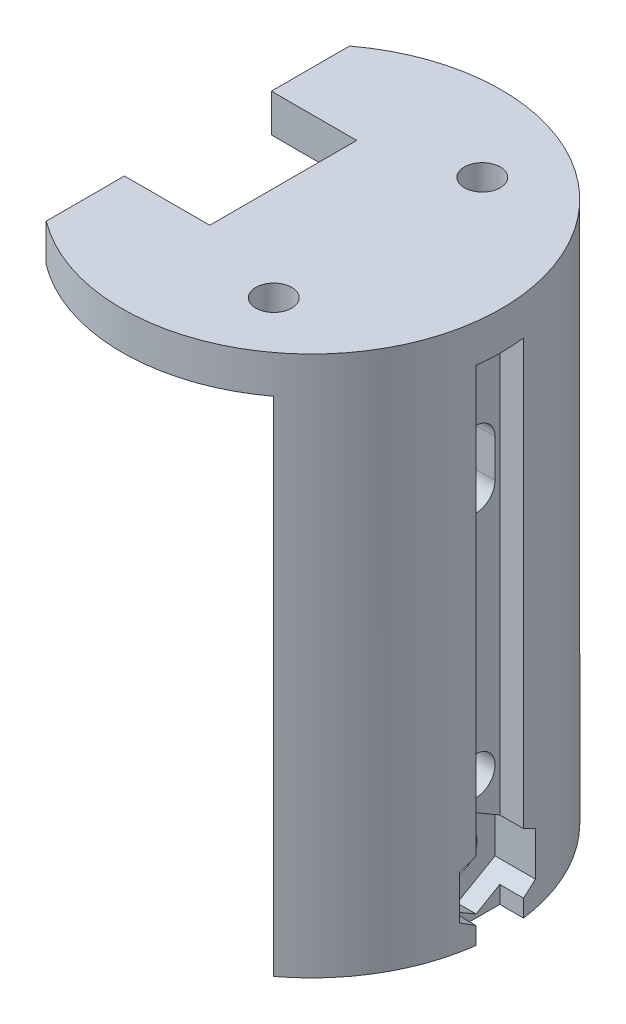
ISO-10303-21;
HEADER;
FILE_DESCRIPTION(('STEP AP214'),'2;1');
FILE_NAME('part.step','',(''),(''),'','','');
FILE_SCHEMA(('AUTOMOTIVE_DESIGN { 1 0 10303 214 1 1 1 1 }'));
ENDSEC;
DATA;
#1=APPLICATION_CONTEXT('core data for automotive mechanical design processes');
#2=APPLICATION_PROTOCOL_DEFINITION('international standard','automotive_design',2000,#1);
#3=PRODUCT_CONTEXT('',#1,'mechanical');
#4=PRODUCT('Part','Part','',(#3));
#5=PRODUCT_RELATED_PRODUCT_CATEGORY('part','',(#4));
#6=PRODUCT_DEFINITION_FORMATION('','',#4);
#7=PRODUCT_DEFINITION_CONTEXT('part definition',#1,'design');
#8=PRODUCT_DEFINITION('design','',#6,#7);
#9=PRODUCT_DEFINITION_SHAPE('','',#8);
#10=(LENGTH_UNIT() NAMED_UNIT(*) SI_UNIT(.MILLI.,.METRE.));
#11=(NAMED_UNIT(*) PLANE_ANGLE_UNIT() SI_UNIT($,.RADIAN.));
#12=(NAMED_UNIT(*) SI_UNIT($,.STERADIAN.) SOLID_ANGLE_UNIT());
#13=UNCERTAINTY_MEASURE_WITH_UNIT(LENGTH_MEASURE(1.E-05),#10,'distance_accuracy_value','');
#14=(GEOMETRIC_REPRESENTATION_CONTEXT(3) GLOBAL_UNCERTAINTY_ASSIGNED_CONTEXT((#13)) GLOBAL_UNIT_ASSIGNED_CONTEXT((#10,
#11,#12)) REPRESENTATION_CONTEXT('',''));
#15=CARTESIAN_POINT('',(0.,0.,0.));
#16=DIRECTION('',(0.,0.,1.));
#17=DIRECTION('',(1.,0.,0.));
#18=AXIS2_PLACEMENT_3D('',#15,#16,#17);
#19=CARTESIAN_POINT('',(22.0257812378826,-67.31,-3.175));
#20=DIRECTION('',(0.,0.,-1.));
#21=DIRECTION('',(-1.,0.,0.));
#22=AXIS2_PLACEMENT_3D('',#19,#20,#21);
#23=PLANE('',#22);
#24=DIRECTION('',(0.,1.,0.));
#25=VECTOR('',#24,1.);
#26=CARTESIAN_POINT('',(22.0257812378826,-67.31,-3.175));
#27=LINE('',#26,#25);
#28=CARTESIAN_POINT('',(22.0257812378826,-56.9272083697105,-3.175));
#29=VERTEX_POINT('',#28);
#30=CARTESIAN_POINT('',(22.0257812378826,0.,-3.175));
#31=VERTEX_POINT('',#30);
#32=EDGE_CURVE('E258',#29,#31,#27,.T.);
#33=ORIENTED_EDGE('',*,*,#32,.F.);
#34=DIRECTION('',(1.,0.,0.));
#35=VECTOR('',#34,1.);
#36=CARTESIAN_POINT('',(25.4009999999925,-56.9272083697105,-3.175));
#37=LINE('',#36,#35);
#38=CARTESIAN_POINT('',(25.2007812378826,-56.9272083697105,-3.175));
#39=VERTEX_POINT('',#38);
#40=EDGE_CURVE('E528',#29,#39,#37,.T.);
#41=ORIENTED_EDGE('',*,*,#40,.T.);
#42=DIRECTION('',(0.,1.,0.));
#43=VECTOR('',#42,1.);
#44=CARTESIAN_POINT('',(25.2007812378826,-67.31,-3.175));
#45=LINE('',#44,#43);
#46=CARTESIAN_POINT('',(25.2007812378826,0.,-3.175));
#47=VERTEX_POINT('',#46);
#48=EDGE_CURVE('E262',#39,#47,#45,.T.);
#49=ORIENTED_EDGE('',*,*,#48,.T.);
#50=DIRECTION('',(-1.,0.,0.));
#51=VECTOR('',#50,1.);
#52=CARTESIAN_POINT('',(22.0257812378826,0.,-3.175));
#53=LINE('',#52,#51);
#54=EDGE_CURVE('E367',#47,#31,#53,.T.);
#55=ORIENTED_EDGE('',*,*,#54,.T.);
#56=EDGE_LOOP('',(#33,#41,#49,#55));
#57=FACE_BOUND('',#56,.T.);
#58=ADVANCED_FACE('F49',(#57),#23,.F.);
#59=CARTESIAN_POINT('',(22.0257812378826,-67.31,3.175));
#60=DIRECTION('',(-1.,0.,0.));
#61=DIRECTION('',(0.,0.,1.));
#62=AXIS2_PLACEMENT_3D('',#59,#60,#61);
#63=PLANE('',#62);
#64=CARTESIAN_POINT('',(22.0257812378826,-50.8,0.));
#65=DIRECTION('',(-1.,0.,0.));
#66=DIRECTION('',(0.,0.,1.));
#67=AXIS2_PLACEMENT_3D('',#64,#65,#66);
#68=CIRCLE('',#67,2.54);
#69=CARTESIAN_POINT('',(22.0257812378826,-50.8,2.54000000000001));
#70=VERTEX_POINT('',#69);
#71=EDGE_CURVE('E403',#70,#70,#68,.F.);
#72=ORIENTED_EDGE('',*,*,#71,.F.);
#73=EDGE_LOOP('',(#72));
#74=FACE_BOUND('',#73,.T.);
#75=DIRECTION('',(0.,-1.,0.));
#76=VECTOR('',#75,1.);
#77=CARTESIAN_POINT('',(22.0257812378826,-12.7,2.54));
#78=LINE('',#77,#76);
#79=CARTESIAN_POINT('',(22.0257812378826,-12.7,2.54));
#80=VERTEX_POINT('',#79);
#81=CARTESIAN_POINT('',(22.0257812378826,-17.78,2.54));
#82=VERTEX_POINT('',#81);
#83=EDGE_CURVE('E448',#80,#82,#78,.T.);
#84=ORIENTED_EDGE('',*,*,#83,.F.);
#85=CARTESIAN_POINT('',(22.0257812378826,-12.7,0.));
#86=DIRECTION('',(-1.,0.,0.));
#87=DIRECTION('',(0.,0.,1.));
#88=AXIS2_PLACEMENT_3D('',#85,#86,#87);
#89=CIRCLE('',#88,2.54);
#90=CARTESIAN_POINT('',(22.0257812378826,-12.7,-2.54));
#91=VERTEX_POINT('',#90);
#92=EDGE_CURVE('E451',#91,#80,#89,.F.);
#93=ORIENTED_EDGE('',*,*,#92,.F.);
#94=DIRECTION('',(0.,1.,0.));
#95=VECTOR('',#94,1.);
#96=CARTESIAN_POINT('',(22.0257812378826,-12.7,-2.54));
#97=LINE('',#96,#95);
#98=CARTESIAN_POINT('',(22.0257812378826,-17.78,-2.54));
#99=VERTEX_POINT('',#98);
#100=EDGE_CURVE('E387',#99,#91,#97,.T.);
#101=ORIENTED_EDGE('',*,*,#100,.F.);
#102=CARTESIAN_POINT('',(22.0257812378826,-17.78,0.));
#103=DIRECTION('',(-1.,0.,0.));
#104=DIRECTION('',(0.,0.,1.));
#105=AXIS2_PLACEMENT_3D('',#102,#103,#104);
#106=CIRCLE('',#105,2.54);
#107=EDGE_CURVE('E73',#82,#99,#106,.F.);
#108=ORIENTED_EDGE('',*,*,#107,.F.);
#109=EDGE_LOOP('',(#84,#93,#101,#108));
#110=FACE_BOUND('',#109,.T.);
#111=DIRECTION('',(0.,1.,0.));
#112=VECTOR('',#111,1.);
#113=CARTESIAN_POINT('',(22.0257812378826,-67.31,3.175));
#114=LINE('',#113,#112);
#115=CARTESIAN_POINT('',(22.0257812378826,-56.9272083697105,3.175));
#116=VERTEX_POINT('',#115);
#117=CARTESIAN_POINT('',(22.0257812378826,0.,3.175));
#118=VERTEX_POINT('',#117);
#119=EDGE_CURVE('E250',#116,#118,#114,.T.);
#120=ORIENTED_EDGE('',*,*,#119,.F.);
#121=DIRECTION('',(0.,-0.500000000000001,0.866025403784438));
#122=VECTOR('',#121,1.);
#123=CARTESIAN_POINT('',(22.0257812378826,-55.0941212650334,0.));
#124=LINE('',#123,#122);
#125=CARTESIAN_POINT('',(22.0257812378826,-55.0941212650334,0.));
#126=VERTEX_POINT('',#125);
#127=EDGE_CURVE('E65',#126,#116,#124,.T.);
#128=ORIENTED_EDGE('',*,*,#127,.F.);
#129=DIRECTION('',(0.,0.5,0.866025403784439));
#130=VECTOR('',#129,1.);
#131=CARTESIAN_POINT('',(22.0257812378826,-58.0270606325167,-5.07999999999998));
#132=LINE('',#131,#130);
#133=EDGE_CURVE('E426',#29,#126,#132,.T.);
#134=ORIENTED_EDGE('',*,*,#133,.F.);
#135=ORIENTED_EDGE('',*,*,#32,.T.);
#136=DIRECTION('',(0.,0.,1.));
#137=VECTOR('',#136,1.);
#138=CARTESIAN_POINT('',(22.0257812378826,0.,3.175));
#139=LINE('',#138,#137);
#140=EDGE_CURVE('E372',#31,#118,#139,.T.);
#141=ORIENTED_EDGE('',*,*,#140,.T.);
#142=EDGE_LOOP('',(#120,#128,#134,#135,#141));
#143=FACE_BOUND('',#142,.T.);
#144=ADVANCED_FACE('F480',(#74,#110,#143),#63,.F.);
#145=CARTESIAN_POINT('',(25.2007812378826,-67.31,3.175));
#146=DIRECTION('',(0.,0.,1.));
#147=DIRECTION('',(1.,0.,0.));
#148=AXIS2_PLACEMENT_3D('',#145,#146,#147);
#149=PLANE('',#148);
#150=CARTESIAN_POINT('',(22.0257812378826,-67.31,3.175));
#151=VERTEX_POINT('',#150);
#152=CARTESIAN_POINT('',(22.0257812378826,-64.9927916302895,3.175));
#153=VERTEX_POINT('',#152);
#154=EDGE_CURVE('E245',#151,#153,#114,.T.);
#155=ORIENTED_EDGE('',*,*,#154,.T.);
#156=DIRECTION('',(1.,0.,0.));
#157=VECTOR('',#156,1.);
#158=CARTESIAN_POINT('',(25.4009999999925,-64.9927916302895,3.175));
#159=LINE('',#158,#157);
#160=CARTESIAN_POINT('',(25.2007812378826,-64.9927916302895,3.175));
#161=VERTEX_POINT('',#160);
#162=EDGE_CURVE('E226',#153,#161,#159,.T.);
#163=ORIENTED_EDGE('',*,*,#162,.T.);
#164=DIRECTION('',(0.,1.,0.));
#165=VECTOR('',#164,1.);
#166=CARTESIAN_POINT('',(25.2007812378826,-67.31,3.175));
#167=LINE('',#166,#165);
#168=CARTESIAN_POINT('',(25.2007812378826,-67.31,3.175));
#169=VERTEX_POINT('',#168);
#170=EDGE_CURVE('E242',#169,#161,#167,.T.);
#171=ORIENTED_EDGE('',*,*,#170,.F.);
#172=DIRECTION('',(1.,0.,0.));
#173=VECTOR('',#172,1.);
#174=CARTESIAN_POINT('',(25.2007812378826,-67.31,3.175));
#175=LINE('',#174,#173);
#176=EDGE_CURVE('E384',#151,#169,#175,.T.);
#177=ORIENTED_EDGE('',*,*,#176,.F.);
#178=EDGE_LOOP('',(#155,#163,#171,#177));
#179=FACE_BOUND('',#178,.T.);
#180=ADVANCED_FACE('F240',(#179),#149,.F.);
#181=CARTESIAN_POINT('',(25.4009999999925,-60.96,0.));
#182=DIRECTION('',(-1.,0.,0.));
#183=DIRECTION('',(0.,0.,1.));
#184=AXIS2_PLACEMENT_3D('',#181,#182,#183);
#185=CYLINDRICAL_SURFACE('',#184,2.667);
#186=CARTESIAN_POINT('',(15.2400000000072,-60.96,0.));
#187=DIRECTION('',(-1.,0.,0.));
#188=DIRECTION('',(0.,0.,1.));
#189=AXIS2_PLACEMENT_3D('',#186,#187,#188);
#190=CIRCLE('',#189,2.667);
#191=CARTESIAN_POINT('',(15.2400000000072,-60.96,2.66700000000001));
#192=VERTEX_POINT('',#191);
#193=EDGE_CURVE('E407',#192,#192,#190,.T.);
#194=ORIENTED_EDGE('',*,*,#193,.T.);
#195=EDGE_LOOP('',(#194));
#196=FACE_BOUND('',#195,.T.);
#197=CARTESIAN_POINT('',(19.4857812378826,-60.96,0.));
#198=DIRECTION('',(1.,0.,0.));
#199=DIRECTION('',(0.,0.,-1.));
#200=AXIS2_PLACEMENT_3D('',#197,#198,#199);
#201=CIRCLE('',#200,2.667);
#202=CARTESIAN_POINT('',(19.4857812378826,-60.96,-2.66699999999999));
#203=VERTEX_POINT('',#202);
#204=EDGE_CURVE('E53',#203,#203,#201,.F.);
#205=ORIENTED_EDGE('',*,*,#204,.F.);
#206=EDGE_LOOP('',(#205));
#207=FACE_BOUND('',#206,.T.);
#208=ADVANCED_FACE('F644',(#196,#207),#185,.F.);
#209=CARTESIAN_POINT('',(0.,0.,0.));
#210=DIRECTION('',(0.,1.,0.));
#211=DIRECTION('',(0.,0.,1.));
#212=AXIS2_PLACEMENT_3D('',#209,#210,#211);
#213=PLANE('',#212);
#214=CARTESIAN_POINT('',(8.89000000000721,0.,-13.970000000004));
#215=DIRECTION('',(0.,-1.,0.));
#216=DIRECTION('',(0.,0.,-1.));
#217=AXIS2_PLACEMENT_3D('',#214,#215,#216);
#218=CIRCLE('',#217,2.41299999999427);
#219=CARTESIAN_POINT('',(8.89000000000721,0.,-16.3829999999983));
#220=VERTEX_POINT('',#219);
#221=EDGE_CURVE('E266',#220,#220,#218,.T.);
#222=ORIENTED_EDGE('',*,*,#221,.F.);
#223=EDGE_LOOP('',(#222));
#224=FACE_BOUND('',#223,.T.);
#225=CARTESIAN_POINT('',(8.89000000000721,0.,13.969999999996));
#226=DIRECTION('',(0.,-1.,0.));
#227=DIRECTION('',(0.,0.,-1.));
#228=AXIS2_PLACEMENT_3D('',#225,#226,#227);
#229=CIRCLE('',#228,2.41299999999427);
#230=CARTESIAN_POINT('',(8.89000000000721,0.,11.5570000000017));
#231=VERTEX_POINT('',#230);
#232=EDGE_CURVE('E267',#231,#231,#229,.T.);
#233=ORIENTED_EDGE('',*,*,#232,.F.);
#234=EDGE_LOOP('',(#233));
#235=FACE_BOUND('',#234,.T.);
#236=DIRECTION('',(0.,0.,-1.));
#237=VECTOR('',#236,1.);
#238=CARTESIAN_POINT('',(15.2400000000072,0.,20.3199999999852));
#239=LINE('',#238,#237);
#240=CARTESIAN_POINT('',(15.2400000000072,0.,20.3199999999852));
#241=VERTEX_POINT('',#240);
#242=CARTESIAN_POINT('',(15.2400000000072,0.,-20.3199999999852));
#243=VERTEX_POINT('',#242);
#244=EDGE_CURVE('E371',#241,#243,#239,.T.);
#245=ORIENTED_EDGE('',*,*,#244,.F.);
#246=CARTESIAN_POINT('',(0.,0.,0.));
#247=DIRECTION('',(0.,1.,0.));
#248=DIRECTION('',(0.,0.,1.));
#249=AXIS2_PLACEMENT_3D('',#246,#247,#248);
#250=CIRCLE('',#249,25.3999999999925);
#251=CARTESIAN_POINT('',(-15.24,0.,20.3199999999906));
#252=VERTEX_POINT('',#251);
#253=EDGE_CURVE('E294',#252,#241,#250,.T.);
#254=ORIENTED_EDGE('',*,*,#253,.F.);
#255=DIRECTION('',(0.,0.,1.));
#256=VECTOR('',#255,1.);
#257=CARTESIAN_POINT('',(-15.24,0.,20.3199999999906));
#258=LINE('',#257,#256);
#259=CARTESIAN_POINT('',(-15.24,0.,9.842499999996));
#260=VERTEX_POINT('',#259);
#261=EDGE_CURVE('E283',#260,#252,#258,.T.);
#262=ORIENTED_EDGE('',*,*,#261,.F.);
#263=DIRECTION('',(-1.,0.,0.));
#264=VECTOR('',#263,1.);
#265=CARTESIAN_POINT('',(-15.24,0.,9.842499999996));
#266=LINE('',#265,#264);
#267=CARTESIAN_POINT('',(-3.81,0.,9.842499999996));
#268=VERTEX_POINT('',#267);
#269=EDGE_CURVE('E304',#268,#260,#266,.T.);
#270=ORIENTED_EDGE('',*,*,#269,.F.);
#271=DIRECTION('',(0.,0.,1.));
#272=VECTOR('',#271,1.);
#273=CARTESIAN_POINT('',(-3.81,0.,9.842499999996));
#274=LINE('',#273,#272);
#275=CARTESIAN_POINT('',(-3.81,0.,-9.842500000004));
#276=VERTEX_POINT('',#275);
#277=EDGE_CURVE('E302',#276,#268,#274,.T.);
#278=ORIENTED_EDGE('',*,*,#277,.F.);
#279=DIRECTION('',(1.,0.,0.));
#280=VECTOR('',#279,1.);
#281=CARTESIAN_POINT('',(-3.81,0.,-9.842500000004));
#282=LINE('',#281,#280);
#283=CARTESIAN_POINT('',(-15.24,0.,-9.842500000004));
#284=VERTEX_POINT('',#283);
#285=EDGE_CURVE('E300',#284,#276,#282,.T.);
#286=ORIENTED_EDGE('',*,*,#285,.F.);
#287=DIRECTION('',(0.,0.,1.));
#288=VECTOR('',#287,1.);
#289=CARTESIAN_POINT('',(-15.24,0.,-9.842500000004));
#290=LINE('',#289,#288);
#291=CARTESIAN_POINT('',(-15.24,0.,-20.3199999999906));
#292=VERTEX_POINT('',#291);
#293=EDGE_CURVE('E297',#292,#284,#290,.T.);
#294=ORIENTED_EDGE('',*,*,#293,.F.);
#295=EDGE_CURVE('E270',#243,#292,#250,.T.);
#296=ORIENTED_EDGE('',*,*,#295,.F.);
#297=EDGE_LOOP('',(#245,#254,#262,#270,#278,#286,#294,#296));
#298=FACE_BOUND('',#297,.T.);
#299=ADVANCED_FACE('F329',(#224,#235,#298),#213,.F.);
#300=DIRECTION('',(1.,0.,0.));
#301=VECTOR('',#300,1.);
#302=CARTESIAN_POINT('',(25.2007812378826,0.,3.175));
#303=LINE('',#302,#301);
#304=CARTESIAN_POINT('',(25.2007812378826,0.,3.175));
#305=VERTEX_POINT('',#304);
#306=EDGE_CURVE('E364',#118,#305,#303,.T.);
#307=ORIENTED_EDGE('',*,*,#306,.F.);
#308=ORIENTED_EDGE('',*,*,#140,.F.);
#309=ORIENTED_EDGE('',*,*,#54,.F.);
#310=EDGE_CURVE('E298',#305,#47,#250,.T.);
#311=ORIENTED_EDGE('',*,*,#310,.F.);
#312=EDGE_LOOP('',(#307,#308,#309,#311));
#313=FACE_BOUND('',#312,.T.);
#314=ADVANCED_FACE('F362',(#313),#213,.F.);
#315=CARTESIAN_POINT('',(0.,5.08,0.));
#316=DIRECTION('',(0.,-1.,0.));
#317=DIRECTION('',(0.,0.,-1.));
#318=AXIS2_PLACEMENT_3D('',#315,#316,#317);
#319=CYLINDRICAL_SURFACE('',#318,25.3999999999925);
#320=ORIENTED_EDGE('',*,*,#170,.T.);
#321=CARTESIAN_POINT('',(0.,-66.8258787349666,0.));
#322=DIRECTION('',(0.,0.866025403784438,-0.500000000000001));
#323=DIRECTION('',(0.,-0.500000000000001,-0.866025403784438));
#324=AXIS2_PLACEMENT_3D('',#321,#322,#323);
#325=ELLIPSE('',#324,29.3293936748243,25.3999999999925);
#326=CARTESIAN_POINT('',(24.8868157866694,-63.8929393674833,5.08000000000001));
#327=VERTEX_POINT('',#326);
#328=EDGE_CURVE('E223',#161,#327,#325,.F.);
#329=ORIENTED_EDGE('',*,*,#328,.T.);
#330=DIRECTION('',(0.,-1.,0.));
#331=VECTOR('',#330,1.);
#332=CARTESIAN_POINT('',(24.8868157866694,5.08,5.08000000000001));
#333=LINE('',#332,#331);
#334=CARTESIAN_POINT('',(24.8868157866694,-58.0270606325167,5.08000000000001));
#335=VERTEX_POINT('',#334);
#336=EDGE_CURVE('E234',#327,#335,#333,.F.);
#337=ORIENTED_EDGE('',*,*,#336,.T.);
#338=CARTESIAN_POINT('',(0.,-55.0941212650334,0.));
#339=DIRECTION('',(0.,-0.866025403784438,-0.500000000000001));
#340=DIRECTION('',(0.,-0.500000000000001,0.866025403784438));
#341=AXIS2_PLACEMENT_3D('',#338,#339,#340);
#342=ELLIPSE('',#341,29.3293936748243,25.3999999999925);
#343=CARTESIAN_POINT('',(25.2007812378826,-56.9272083697105,3.175));
#344=VERTEX_POINT('',#343);
#345=EDGE_CURVE('E235',#335,#344,#342,.F.);
#346=ORIENTED_EDGE('',*,*,#345,.T.);
#347=EDGE_CURVE('E251',#344,#305,#167,.T.);
#348=ORIENTED_EDGE('',*,*,#347,.T.);
#349=ORIENTED_EDGE('',*,*,#310,.T.);
#350=ORIENTED_EDGE('',*,*,#48,.F.);
#351=CARTESIAN_POINT('',(0.,-55.0941212650334,0.));
#352=DIRECTION('',(0.,-0.866025403784438,0.5));
#353=DIRECTION('',(0.,-0.5,-0.866025403784439));
#354=AXIS2_PLACEMENT_3D('',#351,#352,#353);
#355=ELLIPSE('',#354,29.3293936748243,25.3999999999925);
#356=CARTESIAN_POINT('',(24.8868157866694,-58.0270606325167,-5.07999999999998));
#357=VERTEX_POINT('',#356);
#358=EDGE_CURVE('E529',#39,#357,#355,.F.);
#359=ORIENTED_EDGE('',*,*,#358,.T.);
#360=DIRECTION('',(0.,-1.,0.));
#361=VECTOR('',#360,1.);
#362=CARTESIAN_POINT('',(24.8868157866694,5.08,-5.07999999999998));
#363=LINE('',#362,#361);
#364=CARTESIAN_POINT('',(24.8868157866694,-63.8929393674833,-5.07999999999998));
#365=VERTEX_POINT('',#364);
#366=EDGE_CURVE('E522',#357,#365,#363,.T.);
#367=ORIENTED_EDGE('',*,*,#366,.T.);
#368=CARTESIAN_POINT('',(0.,-66.8258787349666,0.));
#369=DIRECTION('',(0.,0.866025403784438,0.500000000000001));
#370=DIRECTION('',(0.,-0.500000000000001,0.866025403784438));
#371=AXIS2_PLACEMENT_3D('',#368,#369,#370);
#372=ELLIPSE('',#371,29.3293936748243,25.3999999999925);
#373=CARTESIAN_POINT('',(25.2007812378826,-64.9927916302895,-3.175));
#374=VERTEX_POINT('',#373);
#375=EDGE_CURVE('E520',#365,#374,#372,.F.);
#376=ORIENTED_EDGE('',*,*,#375,.T.);
#377=CARTESIAN_POINT('',(25.2007812378826,-67.31,-3.175));
#378=VERTEX_POINT('',#377);
#379=EDGE_CURVE('E263',#378,#374,#45,.T.);
#380=ORIENTED_EDGE('',*,*,#379,.F.);
#381=CARTESIAN_POINT('',(7.21644966006352E-12,-67.31,-3.99680288865056E-12));
#382=DIRECTION('',(0.,-1.,0.));
#383=DIRECTION('',(0.,0.,-1.));
#384=AXIS2_PLACEMENT_3D('',#381,#382,#383);
#385=CIRCLE('',#384,25.3999999999849);
#386=CARTESIAN_POINT('',(15.2400000000072,-67.31,-20.3199999999852));
#387=VERTEX_POINT('',#386);
#388=EDGE_CURVE('E374',#387,#378,#385,.T.);
#389=ORIENTED_EDGE('',*,*,#388,.F.);
#390=DIRECTION('',(0.,1.,0.));
#391=VECTOR('',#390,1.);
#392=CARTESIAN_POINT('',(15.2400000000072,-67.31,-20.3199999999852));
#393=LINE('',#392,#391);
#394=EDGE_CURVE('E350',#387,#243,#393,.T.);
#395=ORIENTED_EDGE('',*,*,#394,.T.);
#396=ORIENTED_EDGE('',*,*,#295,.T.);
#397=DIRECTION('',(0.,-1.,0.));
#398=VECTOR('',#397,1.);
#399=CARTESIAN_POINT('',(-15.24,5.08,-20.3199999999906));
#400=LINE('',#399,#398);
#401=CARTESIAN_POINT('',(-15.24,5.08,-20.3199999999906));
#402=VERTEX_POINT('',#401);
#403=EDGE_CURVE('E11',#402,#292,#400,.T.);
#404=ORIENTED_EDGE('',*,*,#403,.F.);
#405=CARTESIAN_POINT('',(0.,5.08,0.));
#406=DIRECTION('',(0.,1.,0.));
#407=DIRECTION('',(0.,0.,1.));
#408=AXIS2_PLACEMENT_3D('',#405,#406,#407);
#409=CIRCLE('',#408,25.3999999999925);
#410=CARTESIAN_POINT('',(-15.24,5.08,20.3199999999906));
#411=VERTEX_POINT('',#410);
#412=EDGE_CURVE('E279',#411,#402,#409,.T.);
#413=ORIENTED_EDGE('',*,*,#412,.F.);
#414=DIRECTION('',(0.,-1.,0.));
#415=VECTOR('',#414,1.);
#416=CARTESIAN_POINT('',(-15.24,5.08,20.3199999999906));
#417=LINE('',#416,#415);
#418=EDGE_CURVE('E293',#411,#252,#417,.T.);
#419=ORIENTED_EDGE('',*,*,#418,.T.);
#420=ORIENTED_EDGE('',*,*,#253,.T.);
#421=DIRECTION('',(0.,1.,0.));
#422=VECTOR('',#421,1.);
#423=CARTESIAN_POINT('',(15.2400000000056,-67.31,20.319999999983));
#424=LINE('',#423,#422);
#425=CARTESIAN_POINT('',(15.2400000000056,-67.31,20.319999999983));
#426=VERTEX_POINT('',#425);
#427=EDGE_CURVE('E254',#426,#241,#424,.T.);
#428=ORIENTED_EDGE('',*,*,#427,.F.);
#429=CARTESIAN_POINT('',(7.21644966006352E-12,-67.31,-3.99680288865056E-12));
#430=DIRECTION('',(0.,-1.,0.));
#431=DIRECTION('',(0.,0.,1.));
#432=AXIS2_PLACEMENT_3D('',#429,#430,#431);
#433=CIRCLE('',#432,25.3999999999886);
#434=EDGE_CURVE('E249',#169,#426,#433,.T.);
#435=ORIENTED_EDGE('',*,*,#434,.F.);
#436=EDGE_LOOP('',(#320,#329,#337,#346,#348,#349,#350,#359,#367,#376,#380,#389,#395,#396,#404,
#413,#419,#420,#428,#435));
#437=FACE_BOUND('',#436,.T.);
#438=ADVANCED_FACE('F51',(#437),#319,.T.);
#439=CARTESIAN_POINT('',(-15.24,5.08,-9.842500000004));
#440=DIRECTION('',(1.,0.,0.));
#441=DIRECTION('',(0.,0.,-1.));
#442=AXIS2_PLACEMENT_3D('',#439,#440,#441);
#443=PLANE('',#442);
#444=ORIENTED_EDGE('',*,*,#293,.T.);
#445=DIRECTION('',(0.,-1.,0.));
#446=VECTOR('',#445,1.);
#447=CARTESIAN_POINT('',(-15.24,5.08,-9.842500000004));
#448=LINE('',#447,#446);
#449=CARTESIAN_POINT('',(-15.24,5.08,-9.842500000004));
#450=VERTEX_POINT('',#449);
#451=EDGE_CURVE('E58',#450,#284,#448,.T.);
#452=ORIENTED_EDGE('',*,*,#451,.F.);
#453=DIRECTION('',(0.,0.,1.));
#454=VECTOR('',#453,1.);
#455=CARTESIAN_POINT('',(-15.24,5.08,-9.842500000004));
#456=LINE('',#455,#454);
#457=EDGE_CURVE('E282',#402,#450,#456,.T.);
#458=ORIENTED_EDGE('',*,*,#457,.F.);
#459=ORIENTED_EDGE('',*,*,#403,.T.);
#460=EDGE_LOOP('',(#444,#452,#458,#459));
#461=FACE_BOUND('',#460,.T.);
#462=ADVANCED_FACE('F346',(#461),#443,.F.);
#463=CARTESIAN_POINT('',(-3.81,5.08,-9.842500000004));
#464=DIRECTION('',(0.,0.,-1.));
#465=DIRECTION('',(-1.,0.,0.));
#466=AXIS2_PLACEMENT_3D('',#463,#464,#465);
#467=PLANE('',#466);
#468=ORIENTED_EDGE('',*,*,#285,.T.);
#469=DIRECTION('',(0.,-1.,0.));
#470=VECTOR('',#469,1.);
#471=CARTESIAN_POINT('',(-3.81,5.08,-9.842500000004));
#472=LINE('',#471,#470);
#473=CARTESIAN_POINT('',(-3.81,5.08,-9.842500000004));
#474=VERTEX_POINT('',#473);
#475=EDGE_CURVE('E315',#474,#276,#472,.T.);
#476=ORIENTED_EDGE('',*,*,#475,.F.);
#477=DIRECTION('',(1.,0.,0.));
#478=VECTOR('',#477,1.);
#479=CARTESIAN_POINT('',(-3.81,5.08,-9.842500000004));
#480=LINE('',#479,#478);
#481=EDGE_CURVE('E285',#450,#474,#480,.T.);
#482=ORIENTED_EDGE('',*,*,#481,.F.);
#483=ORIENTED_EDGE('',*,*,#451,.T.);
#484=EDGE_LOOP('',(#468,#476,#482,#483));
#485=FACE_BOUND('',#484,.T.);
#486=ADVANCED_FACE('F323',(#485),#467,.F.);
#487=CARTESIAN_POINT('',(-3.81,5.08,9.842499999996));
#488=DIRECTION('',(1.,0.,0.));
#489=DIRECTION('',(0.,0.,-1.));
#490=AXIS2_PLACEMENT_3D('',#487,#488,#489);
#491=PLANE('',#490);
#492=ORIENTED_EDGE('',*,*,#277,.T.);
#493=DIRECTION('',(0.,-1.,0.));
#494=VECTOR('',#493,1.);
#495=CARTESIAN_POINT('',(-3.81,5.08,9.842499999996));
#496=LINE('',#495,#494);
#497=CARTESIAN_POINT('',(-3.81,5.08,9.842499999996));
#498=VERTEX_POINT('',#497);
#499=EDGE_CURVE('E312',#498,#268,#496,.T.);
#500=ORIENTED_EDGE('',*,*,#499,.F.);
#501=DIRECTION('',(0.,0.,1.));
#502=VECTOR('',#501,1.);
#503=CARTESIAN_POINT('',(-3.81,5.08,9.842499999996));
#504=LINE('',#503,#502);
#505=EDGE_CURVE('E287',#474,#498,#504,.T.);
#506=ORIENTED_EDGE('',*,*,#505,.F.);
#507=ORIENTED_EDGE('',*,*,#475,.T.);
#508=EDGE_LOOP('',(#492,#500,#506,#507));
#509=FACE_BOUND('',#508,.T.);
#510=ADVANCED_FACE('F334',(#509),#491,.F.);
#511=CARTESIAN_POINT('',(-15.24,5.08,9.842499999996));
#512=DIRECTION('',(0.,0.,1.));
#513=DIRECTION('',(1.,0.,0.));
#514=AXIS2_PLACEMENT_3D('',#511,#512,#513);
#515=PLANE('',#514);
#516=ORIENTED_EDGE('',*,*,#269,.T.);
#517=DIRECTION('',(0.,-1.,0.));
#518=VECTOR('',#517,1.);
#519=CARTESIAN_POINT('',(-15.24,5.08,9.842499999996));
#520=LINE('',#519,#518);
#521=CARTESIAN_POINT('',(-15.24,5.08,9.842499999996));
#522=VERTEX_POINT('',#521);
#523=EDGE_CURVE('E309',#522,#260,#520,.T.);
#524=ORIENTED_EDGE('',*,*,#523,.F.);
#525=DIRECTION('',(-1.,0.,0.));
#526=VECTOR('',#525,1.);
#527=CARTESIAN_POINT('',(-15.24,5.08,9.842499999996));
#528=LINE('',#527,#526);
#529=EDGE_CURVE('E289',#498,#522,#528,.T.);
#530=ORIENTED_EDGE('',*,*,#529,.F.);
#531=ORIENTED_EDGE('',*,*,#499,.T.);
#532=EDGE_LOOP('',(#516,#524,#530,#531));
#533=FACE_BOUND('',#532,.T.);
#534=ADVANCED_FACE('F338',(#533),#515,.F.);
#535=CARTESIAN_POINT('',(-15.24,5.08,20.3199999999906));
#536=DIRECTION('',(1.,0.,0.));
#537=DIRECTION('',(0.,0.,-1.));
#538=AXIS2_PLACEMENT_3D('',#535,#536,#537);
#539=PLANE('',#538);
#540=ORIENTED_EDGE('',*,*,#261,.T.);
#541=ORIENTED_EDGE('',*,*,#418,.F.);
#542=DIRECTION('',(0.,0.,1.));
#543=VECTOR('',#542,1.);
#544=CARTESIAN_POINT('',(-15.24,5.08,20.3199999999906));
#545=LINE('',#544,#543);
#546=EDGE_CURVE('E291',#522,#411,#545,.T.);
#547=ORIENTED_EDGE('',*,*,#546,.F.);
#548=ORIENTED_EDGE('',*,*,#523,.T.);
#549=EDGE_LOOP('',(#540,#541,#547,#548));
#550=FACE_BOUND('',#549,.T.);
#551=ADVANCED_FACE('F744',(#550),#539,.F.);
#552=CARTESIAN_POINT('',(0.,5.08,0.));
#553=DIRECTION('',(0.,1.,0.));
#554=DIRECTION('',(0.,0.,1.));
#555=AXIS2_PLACEMENT_3D('',#552,#553,#554);
#556=PLANE('',#555);
#557=CARTESIAN_POINT('',(8.89000000000721,5.08,13.969999999996));
#558=DIRECTION('',(0.,1.,0.));
#559=DIRECTION('',(0.,0.,1.));
#560=AXIS2_PLACEMENT_3D('',#557,#558,#559);
#561=CIRCLE('',#560,2.41299999999427);
#562=CARTESIAN_POINT('',(8.89000000000721,5.08,16.3829999999903));
#563=VERTEX_POINT('',#562);
#564=EDGE_CURVE('E271',#563,#563,#561,.F.);
#565=ORIENTED_EDGE('',*,*,#564,.T.);
#566=EDGE_LOOP('',(#565));
#567=FACE_BOUND('',#566,.T.);
#568=CARTESIAN_POINT('',(8.89000000000721,5.08,-13.970000000004));
#569=DIRECTION('',(0.,1.,0.));
#570=DIRECTION('',(0.,0.,1.));
#571=AXIS2_PLACEMENT_3D('',#568,#569,#570);
#572=CIRCLE('',#571,2.41299999999427);
#573=CARTESIAN_POINT('',(8.89000000000721,5.08,-11.5570000000097));
#574=VERTEX_POINT('',#573);
#575=EDGE_CURVE('E274',#574,#574,#572,.F.);
#576=ORIENTED_EDGE('',*,*,#575,.T.);
#577=EDGE_LOOP('',(#576));
#578=FACE_BOUND('',#577,.T.);
#579=ORIENTED_EDGE('',*,*,#412,.T.);
#580=ORIENTED_EDGE('',*,*,#457,.T.);
#581=ORIENTED_EDGE('',*,*,#481,.T.);
#582=ORIENTED_EDGE('',*,*,#505,.T.);
#583=ORIENTED_EDGE('',*,*,#529,.T.);
#584=ORIENTED_EDGE('',*,*,#546,.T.);
#585=EDGE_LOOP('',(#579,#580,#581,#582,#583,#584));
#586=FACE_BOUND('',#585,.T.);
#587=ADVANCED_FACE('F342',(#567,#578,#586),#556,.T.);
#588=CARTESIAN_POINT('',(8.89000000000721,5.081,-13.970000000004));
#589=DIRECTION('',(0.,-1.,0.));
#590=DIRECTION('',(0.,0.,-1.));
#591=AXIS2_PLACEMENT_3D('',#588,#589,#590);
#592=CYLINDRICAL_SURFACE('',#591,2.41299999999427);
#593=ORIENTED_EDGE('',*,*,#575,.F.);
#594=EDGE_LOOP('',(#593));
#595=FACE_BOUND('',#594,.T.);
#596=ORIENTED_EDGE('',*,*,#221,.T.);
#597=EDGE_LOOP('',(#596));
#598=FACE_BOUND('',#597,.T.);
#599=ADVANCED_FACE('F512',(#595,#598),#592,.F.);
#600=CARTESIAN_POINT('',(8.89000000000721,5.081,13.969999999996));
#601=DIRECTION('',(0.,-1.,0.));
#602=DIRECTION('',(0.,0.,-1.));
#603=AXIS2_PLACEMENT_3D('',#600,#601,#602);
#604=CYLINDRICAL_SURFACE('',#603,2.41299999999427);
#605=ORIENTED_EDGE('',*,*,#564,.F.);
#606=EDGE_LOOP('',(#605));
#607=FACE_BOUND('',#606,.T.);
#608=ORIENTED_EDGE('',*,*,#232,.T.);
#609=EDGE_LOOP('',(#608));
#610=FACE_BOUND('',#609,.T.);
#611=ADVANCED_FACE('F505',(#607,#610),#604,.F.);
#612=ORIENTED_EDGE('',*,*,#379,.T.);
#613=DIRECTION('',(-1.,0.,0.));
#614=VECTOR('',#613,1.);
#615=CARTESIAN_POINT('',(25.4009999999925,-64.9927916302895,-3.175));
#616=LINE('',#615,#614);
#617=CARTESIAN_POINT('',(22.0257812378826,-64.9927916302895,-3.175));
#618=VERTEX_POINT('',#617);
#619=EDGE_CURVE('E516',#374,#618,#616,.T.);
#620=ORIENTED_EDGE('',*,*,#619,.T.);
#621=CARTESIAN_POINT('',(22.0257812378826,-67.31,-3.175));
#622=VERTEX_POINT('',#621);
#623=EDGE_CURVE('E259',#622,#618,#27,.T.);
#624=ORIENTED_EDGE('',*,*,#623,.F.);
#625=DIRECTION('',(-1.,0.,0.));
#626=VECTOR('',#625,1.);
#627=CARTESIAN_POINT('',(22.0257812378826,-67.31,-3.175));
#628=LINE('',#627,#626);
#629=EDGE_CURVE('E413',#378,#622,#628,.T.);
#630=ORIENTED_EDGE('',*,*,#629,.F.);
#631=EDGE_LOOP('',(#612,#620,#624,#630));
#632=FACE_BOUND('',#631,.T.);
#633=ADVANCED_FACE('F496',(#632),#23,.F.);
#634=DIRECTION('',(0.,0.500000000000001,-0.866025403784438));
#635=VECTOR('',#634,1.);
#636=CARTESIAN_POINT('',(22.0257812378826,-66.8258787349666,0.));
#637=LINE('',#636,#635);
#638=CARTESIAN_POINT('',(22.0257812378826,-66.8258787349666,0.));
#639=VERTEX_POINT('',#638);
#640=EDGE_CURVE('E423',#639,#618,#637,.T.);
#641=ORIENTED_EDGE('',*,*,#640,.F.);
#642=DIRECTION('',(0.,-0.500000000000001,-0.866025403784438));
#643=VECTOR('',#642,1.);
#644=CARTESIAN_POINT('',(22.0257812378826,-63.8929393674833,5.08000000000001));
#645=LINE('',#644,#643);
#646=EDGE_CURVE('E422',#153,#639,#645,.T.);
#647=ORIENTED_EDGE('',*,*,#646,.F.);
#648=ORIENTED_EDGE('',*,*,#154,.F.);
#649=DIRECTION('',(0.,0.,1.));
#650=VECTOR('',#649,1.);
#651=CARTESIAN_POINT('',(22.0257812378826,-67.31,3.175));
#652=LINE('',#651,#650);
#653=EDGE_CURVE('E415',#622,#151,#652,.T.);
#654=ORIENTED_EDGE('',*,*,#653,.F.);
#655=ORIENTED_EDGE('',*,*,#623,.T.);
#656=EDGE_LOOP('',(#641,#647,#648,#654,#655));
#657=FACE_BOUND('',#656,.T.);
#658=ADVANCED_FACE('F421',(#657),#63,.F.);
#659=ORIENTED_EDGE('',*,*,#347,.F.);
#660=DIRECTION('',(-1.,0.,0.));
#661=VECTOR('',#660,1.);
#662=CARTESIAN_POINT('',(25.4009999999925,-56.9272083697105,3.175));
#663=LINE('',#662,#661);
#664=EDGE_CURVE('E246',#344,#116,#663,.T.);
#665=ORIENTED_EDGE('',*,*,#664,.T.);
#666=ORIENTED_EDGE('',*,*,#119,.T.);
#667=ORIENTED_EDGE('',*,*,#306,.T.);
#668=EDGE_LOOP('',(#659,#665,#666,#667));
#669=FACE_BOUND('',#668,.T.);
#670=ADVANCED_FACE('F369',(#669),#149,.F.);
#671=CARTESIAN_POINT('',(15.2400000000072,-67.31,20.3199999999852));
#672=DIRECTION('',(1.,0.,0.));
#673=DIRECTION('',(0.,0.,-1.));
#674=AXIS2_PLACEMENT_3D('',#671,#672,#673);
#675=PLANE('',#674);
#676=DIRECTION('',(0.,-1.,0.));
#677=VECTOR('',#676,1.);
#678=CARTESIAN_POINT('',(15.2400000000072,-12.7,-2.54));
#679=LINE('',#678,#677);
#680=CARTESIAN_POINT('',(15.2400000000072,-12.7,-2.54));
#681=VERTEX_POINT('',#680);
#682=CARTESIAN_POINT('',(15.2400000000072,-17.78,-2.54));
#683=VERTEX_POINT('',#682);
#684=EDGE_CURVE('E456',#681,#683,#679,.T.);
#685=ORIENTED_EDGE('',*,*,#684,.F.);
#686=CARTESIAN_POINT('',(15.2400000000072,-12.7,0.));
#687=DIRECTION('',(-1.,0.,0.));
#688=DIRECTION('',(0.,0.,1.));
#689=AXIS2_PLACEMENT_3D('',#686,#687,#688);
#690=CIRCLE('',#689,2.54);
#691=CARTESIAN_POINT('',(15.2400000000072,-12.7,2.54));
#692=VERTEX_POINT('',#691);
#693=EDGE_CURVE('E454',#692,#681,#690,.T.);
#694=ORIENTED_EDGE('',*,*,#693,.F.);
#695=DIRECTION('',(0.,1.,0.));
#696=VECTOR('',#695,1.);
#697=CARTESIAN_POINT('',(15.2400000000072,-12.7,2.54));
#698=LINE('',#697,#696);
#699=CARTESIAN_POINT('',(15.2400000000072,-17.78,2.54));
#700=VERTEX_POINT('',#699);
#701=EDGE_CURVE('E462',#700,#692,#698,.T.);
#702=ORIENTED_EDGE('',*,*,#701,.F.);
#703=CARTESIAN_POINT('',(15.2400000000072,-17.78,0.));
#704=DIRECTION('',(-1.,0.,0.));
#705=DIRECTION('',(0.,0.,1.));
#706=AXIS2_PLACEMENT_3D('',#703,#704,#705);
#707=CIRCLE('',#706,2.54);
#708=EDGE_CURVE('E459',#683,#700,#707,.T.);
#709=ORIENTED_EDGE('',*,*,#708,.F.);
#710=EDGE_LOOP('',(#685,#694,#702,#709));
#711=FACE_BOUND('',#710,.T.);
#712=CARTESIAN_POINT('',(15.2400000000072,-50.8,0.));
#713=DIRECTION('',(-1.,0.,0.));
#714=DIRECTION('',(0.,0.,1.));
#715=AXIS2_PLACEMENT_3D('',#712,#713,#714);
#716=CIRCLE('',#715,2.54);
#717=CARTESIAN_POINT('',(15.2400000000072,-50.8,2.54000000000001));
#718=VERTEX_POINT('',#717);
#719=EDGE_CURVE('E406',#718,#718,#716,.T.);
#720=ORIENTED_EDGE('',*,*,#719,.F.);
#721=EDGE_LOOP('',(#720));
#722=FACE_BOUND('',#721,.T.);
#723=ORIENTED_EDGE('',*,*,#193,.F.);
#724=EDGE_LOOP('',(#723));
#725=FACE_BOUND('',#724,.T.);
#726=ORIENTED_EDGE('',*,*,#244,.T.);
#727=ORIENTED_EDGE('',*,*,#394,.F.);
#728=DIRECTION('',(0.,0.,-1.));
#729=VECTOR('',#728,1.);
#730=CARTESIAN_POINT('',(15.2400000000072,-67.31,20.3199999999852));
#731=LINE('',#730,#729);
#732=EDGE_CURVE('E378',#426,#387,#731,.T.);
#733=ORIENTED_EDGE('',*,*,#732,.F.);
#734=ORIENTED_EDGE('',*,*,#427,.T.);
#735=EDGE_LOOP('',(#726,#727,#733,#734));
#736=FACE_BOUND('',#735,.T.);
#737=ADVANCED_FACE('F472',(#711,#722,#725,#736),#675,.F.);
#738=CARTESIAN_POINT('',(7.21644966006352E-12,-67.31,-3.99680288865056E-12));
#739=DIRECTION('',(0.,-1.,0.));
#740=DIRECTION('',(0.,0.,-1.));
#741=AXIS2_PLACEMENT_3D('',#738,#739,#740);
#742=PLANE('',#741);
#743=ORIENTED_EDGE('',*,*,#388,.T.);
#744=ORIENTED_EDGE('',*,*,#629,.T.);
#745=ORIENTED_EDGE('',*,*,#653,.T.);
#746=ORIENTED_EDGE('',*,*,#176,.T.);
#747=ORIENTED_EDGE('',*,*,#434,.T.);
#748=ORIENTED_EDGE('',*,*,#732,.T.);
#749=EDGE_LOOP('',(#743,#744,#745,#746,#747,#748));
#750=FACE_BOUND('',#749,.T.);
#751=ADVANCED_FACE('F416',(#750),#742,.T.);
#752=CARTESIAN_POINT('',(25.4009999999925,-50.8,0.));
#753=DIRECTION('',(-1.,0.,0.));
#754=DIRECTION('',(0.,0.,1.));
#755=AXIS2_PLACEMENT_3D('',#752,#753,#754);
#756=CYLINDRICAL_SURFACE('',#755,2.54);
#757=ORIENTED_EDGE('',*,*,#719,.T.);
#758=EDGE_LOOP('',(#757));
#759=FACE_BOUND('',#758,.T.);
#760=ORIENTED_EDGE('',*,*,#71,.T.);
#761=EDGE_LOOP('',(#760));
#762=FACE_BOUND('',#761,.T.);
#763=ADVANCED_FACE('F484',(#759,#762),#756,.F.);
#764=CARTESIAN_POINT('',(25.4009999999925,-12.7,0.));
#765=DIRECTION('',(-1.,0.,0.));
#766=DIRECTION('',(0.,0.,1.));
#767=AXIS2_PLACEMENT_3D('',#764,#765,#766);
#768=CYLINDRICAL_SURFACE('',#767,2.54);
#769=ORIENTED_EDGE('',*,*,#92,.T.);
#770=DIRECTION('',(-1.,0.,0.));
#771=VECTOR('',#770,1.);
#772=CARTESIAN_POINT('',(25.4009999999925,-12.7,2.54));
#773=LINE('',#772,#771);
#774=EDGE_CURVE('E391',#80,#692,#773,.T.);
#775=ORIENTED_EDGE('',*,*,#774,.T.);
#776=ORIENTED_EDGE('',*,*,#693,.T.);
#777=DIRECTION('',(-1.,0.,0.));
#778=VECTOR('',#777,1.);
#779=CARTESIAN_POINT('',(25.4009999999925,-12.7,-2.54));
#780=LINE('',#779,#778);
#781=EDGE_CURVE('E401',#91,#681,#780,.T.);
#782=ORIENTED_EDGE('',*,*,#781,.F.);
#783=EDGE_LOOP('',(#769,#775,#776,#782));
#784=FACE_BOUND('',#783,.T.);
#785=ADVANCED_FACE('F482',(#784),#768,.F.);
#786=CARTESIAN_POINT('',(25.4009999999925,-12.7,2.54));
#787=DIRECTION('',(0.,0.,1.));
#788=DIRECTION('',(0.,-1.,0.));
#789=AXIS2_PLACEMENT_3D('',#786,#787,#788);
#790=PLANE('',#789);
#791=ORIENTED_EDGE('',*,*,#83,.T.);
#792=DIRECTION('',(-1.,0.,0.));
#793=VECTOR('',#792,1.);
#794=CARTESIAN_POINT('',(25.4009999999925,-17.78,2.54));
#795=LINE('',#794,#793);
#796=EDGE_CURVE('E397',#82,#700,#795,.T.);
#797=ORIENTED_EDGE('',*,*,#796,.T.);
#798=ORIENTED_EDGE('',*,*,#701,.T.);
#799=ORIENTED_EDGE('',*,*,#774,.F.);
#800=EDGE_LOOP('',(#791,#797,#798,#799));
#801=FACE_BOUND('',#800,.T.);
#802=ADVANCED_FACE('F478',(#801),#790,.F.);
#803=CARTESIAN_POINT('',(25.4009999999925,-17.78,0.));
#804=DIRECTION('',(-1.,0.,0.));
#805=DIRECTION('',(0.,0.,1.));
#806=AXIS2_PLACEMENT_3D('',#803,#804,#805);
#807=CYLINDRICAL_SURFACE('',#806,2.54);
#808=ORIENTED_EDGE('',*,*,#107,.T.);
#809=DIRECTION('',(-1.,0.,0.));
#810=VECTOR('',#809,1.);
#811=CARTESIAN_POINT('',(25.4009999999925,-17.78,-2.54));
#812=LINE('',#811,#810);
#813=EDGE_CURVE('E465',#99,#683,#812,.T.);
#814=ORIENTED_EDGE('',*,*,#813,.T.);
#815=ORIENTED_EDGE('',*,*,#708,.T.);
#816=ORIENTED_EDGE('',*,*,#796,.F.);
#817=EDGE_LOOP('',(#808,#814,#815,#816));
#818=FACE_BOUND('',#817,.T.);
#819=ADVANCED_FACE('F475',(#818),#807,.F.);
#820=CARTESIAN_POINT('',(25.4009999999925,-12.7,-2.54));
#821=DIRECTION('',(0.,0.,-1.));
#822=DIRECTION('',(-1.,0.,0.));
#823=AXIS2_PLACEMENT_3D('',#820,#821,#822);
#824=PLANE('',#823);
#825=ORIENTED_EDGE('',*,*,#100,.T.);
#826=ORIENTED_EDGE('',*,*,#781,.T.);
#827=ORIENTED_EDGE('',*,*,#684,.T.);
#828=ORIENTED_EDGE('',*,*,#813,.F.);
#829=EDGE_LOOP('',(#825,#826,#827,#828));
#830=FACE_BOUND('',#829,.T.);
#831=ADVANCED_FACE('F467',(#830),#824,.F.);
#832=CARTESIAN_POINT('',(19.4857812378826,0.,0.));
#833=DIRECTION('',(1.,0.,0.));
#834=DIRECTION('',(0.,0.,-1.));
#835=AXIS2_PLACEMENT_3D('',#832,#833,#834);
#836=PLANE('',#835);
#837=DIRECTION('',(0.,-0.500000000000001,-0.866025403784438));
#838=VECTOR('',#837,1.);
#839=CARTESIAN_POINT('',(19.4857812378826,-63.8929393674833,5.08000000000001));
#840=LINE('',#839,#838);
#841=CARTESIAN_POINT('',(19.4857812378826,-63.8929393674833,5.08000000000001));
#842=VERTEX_POINT('',#841);
#843=CARTESIAN_POINT('',(19.4857812378826,-66.8258787349666,0.));
#844=VERTEX_POINT('',#843);
#845=EDGE_CURVE('E435',#842,#844,#840,.T.);
#846=ORIENTED_EDGE('',*,*,#845,.T.);
#847=DIRECTION('',(0.,0.500000000000001,-0.866025403784438));
#848=VECTOR('',#847,1.);
#849=CARTESIAN_POINT('',(19.4857812378826,-66.8258787349666,0.));
#850=LINE('',#849,#848);
#851=CARTESIAN_POINT('',(19.4857812378826,-63.8929393674833,-5.07999999999998));
#852=VERTEX_POINT('',#851);
#853=EDGE_CURVE('E535',#844,#852,#850,.T.);
#854=ORIENTED_EDGE('',*,*,#853,.T.);
#855=DIRECTION('',(0.,1.,0.));
#856=VECTOR('',#855,1.);
#857=CARTESIAN_POINT('',(19.4857812378826,-63.8929393674833,-5.07999999999998));
#858=LINE('',#857,#856);
#859=CARTESIAN_POINT('',(19.4857812378826,-58.0270606325167,-5.07999999999998));
#860=VERTEX_POINT('',#859);
#861=EDGE_CURVE('E538',#852,#860,#858,.T.);
#862=ORIENTED_EDGE('',*,*,#861,.T.);
#863=DIRECTION('',(0.,0.5,0.866025403784439));
#864=VECTOR('',#863,1.);
#865=CARTESIAN_POINT('',(19.4857812378826,-58.0270606325167,-5.07999999999998));
#866=LINE('',#865,#864);
#867=CARTESIAN_POINT('',(19.4857812378826,-55.0941212650334,0.));
#868=VERTEX_POINT('',#867);
#869=EDGE_CURVE('E541',#860,#868,#866,.T.);
#870=ORIENTED_EDGE('',*,*,#869,.T.);
#871=DIRECTION('',(0.,-0.500000000000001,0.866025403784438));
#872=VECTOR('',#871,1.);
#873=CARTESIAN_POINT('',(19.4857812378826,-55.0941212650334,0.));
#874=LINE('',#873,#872);
#875=CARTESIAN_POINT('',(19.4857812378826,-58.0270606325167,5.08000000000001));
#876=VERTEX_POINT('',#875);
#877=EDGE_CURVE('E543',#868,#876,#874,.T.);
#878=ORIENTED_EDGE('',*,*,#877,.T.);
#879=DIRECTION('',(0.,-1.,0.));
#880=VECTOR('',#879,1.);
#881=CARTESIAN_POINT('',(19.4857812378826,-58.0270606325167,5.08000000000001));
#882=LINE('',#881,#880);
#883=EDGE_CURVE('E430',#876,#842,#882,.T.);
#884=ORIENTED_EDGE('',*,*,#883,.T.);
#885=EDGE_LOOP('',(#846,#854,#862,#870,#878,#884));
#886=FACE_BOUND('',#885,.T.);
#887=ORIENTED_EDGE('',*,*,#204,.T.);
#888=EDGE_LOOP('',(#887));
#889=FACE_BOUND('',#888,.T.);
#890=ADVANCED_FACE('F549',(#886,#889),#836,.T.);
#891=CARTESIAN_POINT('',(19.4857812378826,-63.8929393674833,5.08000000000001));
#892=DIRECTION('',(0.,-0.866025403784438,0.500000000000001));
#893=DIRECTION('',(0.,-0.500000000000001,-0.866025403784438));
#894=AXIS2_PLACEMENT_3D('',#891,#892,#893);
#895=PLANE('',#894);
#896=ORIENTED_EDGE('',*,*,#646,.T.);
#897=DIRECTION('',(1.,0.,0.));
#898=VECTOR('',#897,1.);
#899=CARTESIAN_POINT('',(19.4857812378826,-66.8258787349666,0.));
#900=LINE('',#899,#898);
#901=EDGE_CURVE('E445',#844,#639,#900,.T.);
#902=ORIENTED_EDGE('',*,*,#901,.F.);
#903=ORIENTED_EDGE('',*,*,#845,.F.);
#904=DIRECTION('',(1.,0.,0.));
#905=VECTOR('',#904,1.);
#906=CARTESIAN_POINT('',(19.4857812378826,-63.8929393674833,5.08000000000001));
#907=LINE('',#906,#905);
#908=EDGE_CURVE('E229',#842,#327,#907,.T.);
#909=ORIENTED_EDGE('',*,*,#908,.T.);
#910=ORIENTED_EDGE('',*,*,#328,.F.);
#911=ORIENTED_EDGE('',*,*,#162,.F.);
#912=EDGE_LOOP('',(#896,#902,#903,#909,#910,#911));
#913=FACE_BOUND('',#912,.T.);
#914=ADVANCED_FACE('F225',(#913),#895,.F.);
#915=CARTESIAN_POINT('',(19.4857812378826,-58.0270606325167,5.08000000000001));
#916=DIRECTION('',(0.,0.,1.));
#917=DIRECTION('',(1.,0.,0.));
#918=AXIS2_PLACEMENT_3D('',#915,#916,#917);
#919=PLANE('',#918);
#920=ORIENTED_EDGE('',*,*,#908,.F.);
#921=ORIENTED_EDGE('',*,*,#883,.F.);
#922=DIRECTION('',(1.,0.,0.));
#923=VECTOR('',#922,1.);
#924=CARTESIAN_POINT('',(19.4857812378826,-58.0270606325167,5.08000000000001));
#925=LINE('',#924,#923);
#926=EDGE_CURVE('E437',#876,#335,#925,.T.);
#927=ORIENTED_EDGE('',*,*,#926,.T.);
#928=ORIENTED_EDGE('',*,*,#336,.F.);
#929=EDGE_LOOP('',(#920,#921,#927,#928));
#930=FACE_BOUND('',#929,.T.);
#931=ADVANCED_FACE('F552',(#930),#919,.F.);
#932=CARTESIAN_POINT('',(19.4857812378826,-55.0941212650334,0.));
#933=DIRECTION('',(0.,0.866025403784438,0.500000000000001));
#934=DIRECTION('',(0.,-0.500000000000001,0.866025403784438));
#935=AXIS2_PLACEMENT_3D('',#932,#933,#934);
#936=PLANE('',#935);
#937=ORIENTED_EDGE('',*,*,#127,.T.);
#938=ORIENTED_EDGE('',*,*,#664,.F.);
#939=ORIENTED_EDGE('',*,*,#345,.F.);
#940=ORIENTED_EDGE('',*,*,#926,.F.);
#941=ORIENTED_EDGE('',*,*,#877,.F.);
#942=DIRECTION('',(1.,0.,0.));
#943=VECTOR('',#942,1.);
#944=CARTESIAN_POINT('',(19.4857812378826,-55.0941212650334,0.));
#945=LINE('',#944,#943);
#946=EDGE_CURVE('E439',#868,#126,#945,.T.);
#947=ORIENTED_EDGE('',*,*,#946,.T.);
#948=EDGE_LOOP('',(#937,#938,#939,#940,#941,#947));
#949=FACE_BOUND('',#948,.T.);
#950=ADVANCED_FACE('F563',(#949),#936,.F.);
#951=CARTESIAN_POINT('',(19.4857812378826,-58.0270606325167,-5.07999999999998));
#952=DIRECTION('',(0.,0.866025403784438,-0.5));
#953=DIRECTION('',(0.,0.5,0.866025403784439));
#954=AXIS2_PLACEMENT_3D('',#951,#952,#953);
#955=PLANE('',#954);
#956=ORIENTED_EDGE('',*,*,#133,.T.);
#957=ORIENTED_EDGE('',*,*,#946,.F.);
#958=ORIENTED_EDGE('',*,*,#869,.F.);
#959=DIRECTION('',(1.,0.,0.));
#960=VECTOR('',#959,1.);
#961=CARTESIAN_POINT('',(19.4857812378826,-58.0270606325167,-5.07999999999998));
#962=LINE('',#961,#960);
#963=EDGE_CURVE('E441',#860,#357,#962,.T.);
#964=ORIENTED_EDGE('',*,*,#963,.T.);
#965=ORIENTED_EDGE('',*,*,#358,.F.);
#966=ORIENTED_EDGE('',*,*,#40,.F.);
#967=EDGE_LOOP('',(#956,#957,#958,#964,#965,#966));
#968=FACE_BOUND('',#967,.T.);
#969=ADVANCED_FACE('F561',(#968),#955,.F.);
#970=CARTESIAN_POINT('',(19.4857812378826,-63.8929393674833,-5.07999999999998));
#971=DIRECTION('',(0.,0.,-1.));
#972=DIRECTION('',(-1.,0.,0.));
#973=AXIS2_PLACEMENT_3D('',#970,#971,#972);
#974=PLANE('',#973);
#975=ORIENTED_EDGE('',*,*,#963,.F.);
#976=ORIENTED_EDGE('',*,*,#861,.F.);
#977=DIRECTION('',(1.,0.,0.));
#978=VECTOR('',#977,1.);
#979=CARTESIAN_POINT('',(19.4857812378826,-63.8929393674833,-5.07999999999998));
#980=LINE('',#979,#978);
#981=EDGE_CURVE('E443',#852,#365,#980,.T.);
#982=ORIENTED_EDGE('',*,*,#981,.T.);
#983=ORIENTED_EDGE('',*,*,#366,.F.);
#984=EDGE_LOOP('',(#975,#976,#982,#983));
#985=FACE_BOUND('',#984,.T.);
#986=ADVANCED_FACE('F559',(#985),#974,.F.);
#987=CARTESIAN_POINT('',(19.4857812378826,-66.8258787349666,0.));
#988=DIRECTION('',(0.,-0.866025403784438,-0.500000000000001));
#989=DIRECTION('',(0.,0.500000000000001,-0.866025403784438));
#990=AXIS2_PLACEMENT_3D('',#987,#988,#989);
#991=PLANE('',#990);
#992=ORIENTED_EDGE('',*,*,#640,.T.);
#993=ORIENTED_EDGE('',*,*,#619,.F.);
#994=ORIENTED_EDGE('',*,*,#375,.F.);
#995=ORIENTED_EDGE('',*,*,#981,.F.);
#996=ORIENTED_EDGE('',*,*,#853,.F.);
#997=ORIENTED_EDGE('',*,*,#901,.T.);
#998=EDGE_LOOP('',(#992,#993,#994,#995,#996,#997));
#999=FACE_BOUND('',#998,.T.);
#1000=ADVANCED_FACE('F555',(#999),#991,.F.);
#1001=CLOSED_SHELL('',(#58,#144,#180,#208,#299,#314,#438,#462,#486,#510,#534,#551,#587,#599,
#611,#633,#658,#670,#737,#751,#763,#785,#802,#819,#831,#890,#914,#931,#950,#969,#986,#1000));
#1002=MANIFOLD_SOLID_BREP('B2',#1001);
#1003=ADVANCED_BREP_SHAPE_REPRESENTATION('',(#18,#1002),#14);
#1004=SHAPE_DEFINITION_REPRESENTATION(#9,#1003);
ENDSEC;
END-ISO-10303-21;
